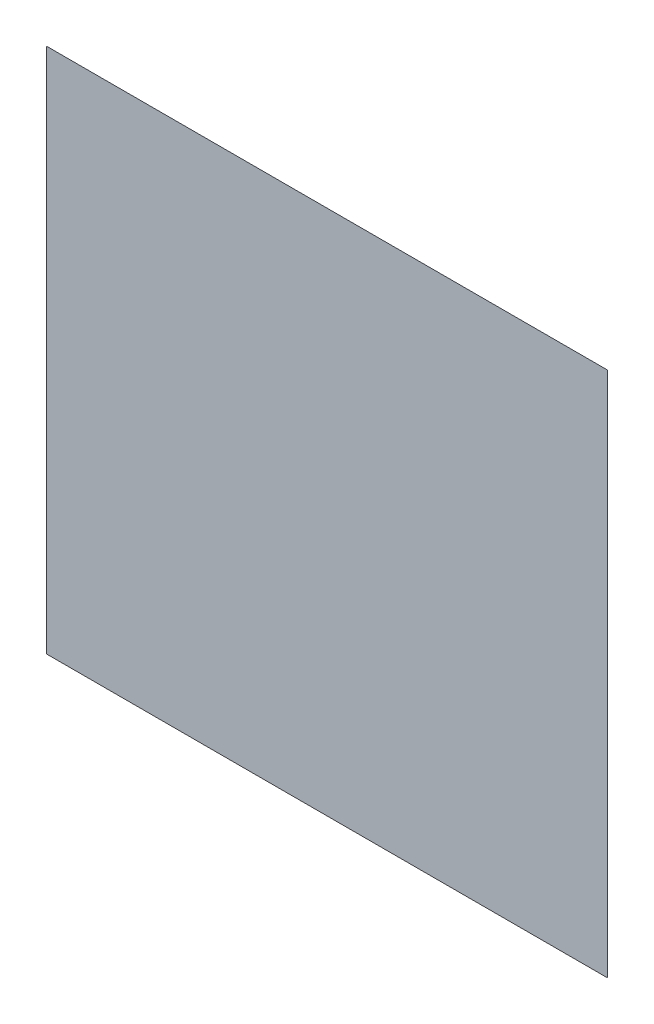
ISO-10303-21;
HEADER;
FILE_DESCRIPTION(('STEP AP214'),'2;1');
FILE_NAME('part.step','',(''),(''),'','','');
FILE_SCHEMA(('AUTOMOTIVE_DESIGN { 1 0 10303 214 1 1 1 1 }'));
ENDSEC;
DATA;
#1=APPLICATION_CONTEXT('core data for automotive mechanical design processes');
#2=APPLICATION_PROTOCOL_DEFINITION('international standard','automotive_design',2000,#1);
#3=PRODUCT_CONTEXT('',#1,'mechanical');
#4=PRODUCT('Part','Part','',(#3));
#5=PRODUCT_RELATED_PRODUCT_CATEGORY('part','',(#4));
#6=PRODUCT_DEFINITION_FORMATION('','',#4);
#7=PRODUCT_DEFINITION_CONTEXT('part definition',#1,'design');
#8=PRODUCT_DEFINITION('design','',#6,#7);
#9=PRODUCT_DEFINITION_SHAPE('','',#8);
#10=(LENGTH_UNIT() NAMED_UNIT(*) SI_UNIT(.MILLI.,.METRE.));
#11=(NAMED_UNIT(*) PLANE_ANGLE_UNIT() SI_UNIT($,.RADIAN.));
#12=(NAMED_UNIT(*) SI_UNIT($,.STERADIAN.) SOLID_ANGLE_UNIT());
#13=UNCERTAINTY_MEASURE_WITH_UNIT(LENGTH_MEASURE(1.E-05),#10,'distance_accuracy_value','');
#14=(GEOMETRIC_REPRESENTATION_CONTEXT(3) GLOBAL_UNCERTAINTY_ASSIGNED_CONTEXT((#13)) GLOBAL_UNIT_ASSIGNED_CONTEXT((#10,
#11,#12)) REPRESENTATION_CONTEXT('',''));
#15=CARTESIAN_POINT('',(0.,0.,0.));
#16=DIRECTION('',(0.,0.,1.));
#17=DIRECTION('',(1.,0.,0.));
#18=AXIS2_PLACEMENT_3D('',#15,#16,#17);
#19=CARTESIAN_POINT('',(8.057399902344,28.836999511719,1.1596000001));
#20=DIRECTION('',(0.,0.,1.));
#21=DIRECTION('',(1.,0.,0.));
#22=AXIS2_PLACEMENT_3D('',#19,#20,#21);
#23=PLANE('',#22);
#24=CARTESIAN_POINT('',(7.257399902344,28.086999511719,1.1596000001));
#25=DIRECTION('',(1.,0.,0.));
#26=VECTOR('',#25,1.);
#27=LINE('',#24,#26);
#28=CARTESIAN_POINT('',(7.257399902344,28.086999511719,1.1595500001));
#29=VERTEX_POINT('',#28);
#30=CARTESIAN_POINT('',(8.857399902344,28.086999511719,1.1595500001));
#31=VERTEX_POINT('',#30);
#32=EDGE_CURVE('E49',#29,#31,#27,.T.);
#33=ORIENTED_EDGE('',*,*,#32,.T.);
#34=CARTESIAN_POINT('',(8.857399902344,28.086999511719,1.1596000001));
#35=DIRECTION('',(0.,1.,0.));
#36=VECTOR('',#35,1.);
#37=LINE('',#34,#36);
#38=CARTESIAN_POINT('',(8.857399902344,29.586999511719,1.1595500001));
#39=VERTEX_POINT('',#38);
#40=EDGE_CURVE('E58',#31,#39,#37,.T.);
#41=ORIENTED_EDGE('',*,*,#40,.T.);
#42=CARTESIAN_POINT('',(8.857399902344,29.586999511719,1.1596000001));
#43=DIRECTION('',(-1.,0.,0.));
#44=VECTOR('',#43,1.);
#45=LINE('',#42,#44);
#46=CARTESIAN_POINT('',(7.257399902344,29.586999511719,1.1595500001));
#47=VERTEX_POINT('',#46);
#48=EDGE_CURVE('E11',#39,#47,#45,.T.);
#49=ORIENTED_EDGE('',*,*,#48,.T.);
#50=CARTESIAN_POINT('',(7.257399902344,29.586999511719,1.1596000001));
#51=DIRECTION('',(0.,-1.,0.));
#52=VECTOR('',#51,1.);
#53=LINE('',#50,#52);
#54=EDGE_CURVE('E29',#47,#29,#53,.T.);
#55=ORIENTED_EDGE('',*,*,#54,.T.);
#56=EDGE_LOOP('',(#33,#41,#49,#55));
#57=FACE_BOUND('',#56,.T.);
#58=ADVANCED_FACE('F17',(#57),#23,.T.);
#59=CARTESIAN_POINT('',(8.057399902344,28.836999511719,1.1595000001));
#60=DIRECTION('',(0.,0.,1.));
#61=DIRECTION('',(1.,0.,0.));
#62=AXIS2_PLACEMENT_3D('',#59,#60,#61);
#63=PLANE('',#62);
#64=ORIENTED_EDGE('',*,*,#40,.F.);
#65=ORIENTED_EDGE('',*,*,#32,.F.);
#66=ORIENTED_EDGE('',*,*,#54,.F.);
#67=ORIENTED_EDGE('',*,*,#48,.F.);
#68=EDGE_LOOP('',(#64,#65,#66,#67));
#69=FACE_BOUND('',#68,.T.);
#70=ADVANCED_FACE('F57',(#69),#63,.F.);
#71=CLOSED_SHELL('',(#58,#70));
#72=MANIFOLD_SOLID_BREP('B1',#71);
#73=ADVANCED_BREP_SHAPE_REPRESENTATION('',(#18,#72),#14);
#74=SHAPE_DEFINITION_REPRESENTATION(#9,#73);
ENDSEC;
END-ISO-10303-21;
